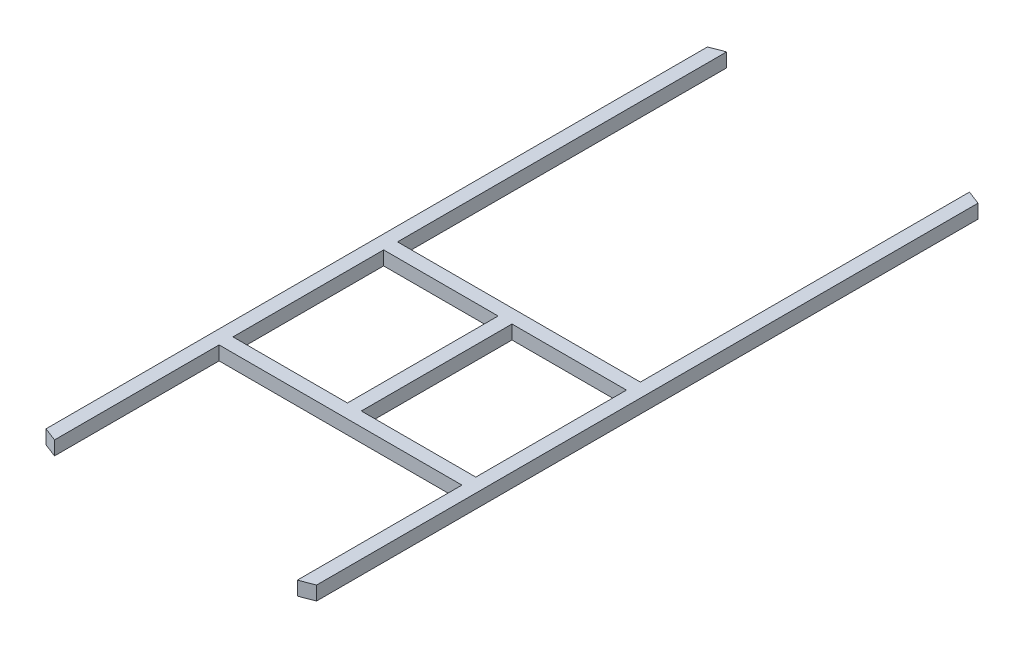
ISO-10303-21;
HEADER;
FILE_DESCRIPTION(('STEP AP214'),'2;1');
FILE_NAME('part.step','',(''),(''),'','','');
FILE_SCHEMA(('AUTOMOTIVE_DESIGN { 1 0 10303 214 1 1 1 1 }'));
ENDSEC;
DATA;
#1=APPLICATION_CONTEXT('core data for automotive mechanical design processes');
#2=APPLICATION_PROTOCOL_DEFINITION('international standard','automotive_design',2000,#1);
#3=PRODUCT_CONTEXT('',#1,'mechanical');
#4=PRODUCT('Part','Part','',(#3));
#5=PRODUCT_RELATED_PRODUCT_CATEGORY('part','',(#4));
#6=PRODUCT_DEFINITION_FORMATION('','',#4);
#7=PRODUCT_DEFINITION_CONTEXT('part definition',#1,'design');
#8=PRODUCT_DEFINITION('design','',#6,#7);
#9=PRODUCT_DEFINITION_SHAPE('','',#8);
#10=(LENGTH_UNIT() NAMED_UNIT(*) SI_UNIT(.MILLI.,.METRE.));
#11=(NAMED_UNIT(*) PLANE_ANGLE_UNIT() SI_UNIT($,.RADIAN.));
#12=(NAMED_UNIT(*) SI_UNIT($,.STERADIAN.) SOLID_ANGLE_UNIT());
#13=UNCERTAINTY_MEASURE_WITH_UNIT(LENGTH_MEASURE(1.E-05),#10,'distance_accuracy_value','');
#14=(GEOMETRIC_REPRESENTATION_CONTEXT(3) GLOBAL_UNCERTAINTY_ASSIGNED_CONTEXT((#13)) GLOBAL_UNIT_ASSIGNED_CONTEXT((#10,
#11,#12)) REPRESENTATION_CONTEXT('',''));
#15=CARTESIAN_POINT('',(0.,0.,0.));
#16=DIRECTION('',(0.,0.,1.));
#17=DIRECTION('',(1.,0.,0.));
#18=AXIS2_PLACEMENT_3D('',#15,#16,#17);
#19=CARTESIAN_POINT('',(0.,4.,0.));
#20=DIRECTION('',(0.,1.,0.));
#21=DIRECTION('',(0.,0.,1.));
#22=AXIS2_PLACEMENT_3D('',#19,#20,#21);
#23=PLANE('',#22);
#24=DIRECTION('',(0.,0.,1.));
#25=VECTOR('',#24,1.);
#26=CARTESIAN_POINT('',(0.,4.,95.33));
#27=LINE('',#26,#25);
#28=CARTESIAN_POINT('',(0.,4.,-95.33));
#29=VERTEX_POINT('',#28);
#30=CARTESIAN_POINT('',(0.,4.,95.33));
#31=VERTEX_POINT('',#30);
#32=EDGE_CURVE('E274',#29,#31,#27,.T.);
#33=ORIENTED_EDGE('',*,*,#32,.T.);
#34=DIRECTION('',(0.933225292836744,0.,0.35929173774215));
#35=VECTOR('',#34,1.);
#36=CARTESIAN_POINT('',(4.,4.,96.87));
#37=LINE('',#36,#35);
#38=CARTESIAN_POINT('',(4.,4.,96.87));
#39=VERTEX_POINT('',#38);
#40=EDGE_CURVE('E278',#31,#39,#37,.T.);
#41=ORIENTED_EDGE('',*,*,#40,.T.);
#42=DIRECTION('',(0.,0.,-1.));
#43=VECTOR('',#42,1.);
#44=CARTESIAN_POINT('',(4.,4.,49.435));
#45=LINE('',#44,#43);
#46=CARTESIAN_POINT('',(4.,4.,49.435));
#47=VERTEX_POINT('',#46);
#48=EDGE_CURVE('E282',#39,#47,#45,.T.);
#49=ORIENTED_EDGE('',*,*,#48,.T.);
#50=DIRECTION('',(1.,0.,0.));
#51=VECTOR('',#50,1.);
#52=CARTESIAN_POINT('',(4.,4.,49.435));
#53=LINE('',#52,#51);
#54=CARTESIAN_POINT('',(74.,4.,49.435));
#55=VERTEX_POINT('',#54);
#56=EDGE_CURVE('E285',#47,#55,#53,.T.);
#57=ORIENTED_EDGE('',*,*,#56,.T.);
#58=DIRECTION('',(0.,0.,1.));
#59=VECTOR('',#58,1.);
#60=CARTESIAN_POINT('',(74.,4.,49.435));
#61=LINE('',#60,#59);
#62=CARTESIAN_POINT('',(74.,4.,96.87));
#63=VERTEX_POINT('',#62);
#64=EDGE_CURVE('E288',#55,#63,#61,.T.);
#65=ORIENTED_EDGE('',*,*,#64,.T.);
#66=DIRECTION('',(0.933225292836744,0.,-0.359291737742149));
#67=VECTOR('',#66,1.);
#68=CARTESIAN_POINT('',(74.,4.,96.87));
#69=LINE('',#68,#67);
#70=CARTESIAN_POINT('',(78.,4.,95.33));
#71=VERTEX_POINT('',#70);
#72=EDGE_CURVE('E291',#63,#71,#69,.T.);
#73=ORIENTED_EDGE('',*,*,#72,.T.);
#74=DIRECTION('',(0.,0.,-1.));
#75=VECTOR('',#74,1.);
#76=CARTESIAN_POINT('',(78.,4.,95.33));
#77=LINE('',#76,#75);
#78=CARTESIAN_POINT('',(78.,4.,-95.33));
#79=VERTEX_POINT('',#78);
#80=EDGE_CURVE('E294',#71,#79,#77,.T.);
#81=ORIENTED_EDGE('',*,*,#80,.T.);
#82=DIRECTION('',(-0.933225292836747,0.,-0.359291737742142));
#83=VECTOR('',#82,1.);
#84=CARTESIAN_POINT('',(78.,4.,-95.33));
#85=LINE('',#84,#83);
#86=CARTESIAN_POINT('',(74.,4.,-96.87));
#87=VERTEX_POINT('',#86);
#88=EDGE_CURVE('E297',#79,#87,#85,.T.);
#89=ORIENTED_EDGE('',*,*,#88,.T.);
#90=DIRECTION('',(0.,0.,1.));
#91=VECTOR('',#90,1.);
#92=CARTESIAN_POINT('',(74.,4.,-96.87));
#93=LINE('',#92,#91);
#94=CARTESIAN_POINT('',(74.,4.,-1.99999999999999));
#95=VERTEX_POINT('',#94);
#96=EDGE_CURVE('E300',#87,#95,#93,.T.);
#97=ORIENTED_EDGE('',*,*,#96,.T.);
#98=DIRECTION('',(-1.,0.,0.));
#99=VECTOR('',#98,1.);
#100=CARTESIAN_POINT('',(74.,4.,-1.99999999999999));
#101=LINE('',#100,#99);
#102=CARTESIAN_POINT('',(4.,4.,-1.99999999999999));
#103=VERTEX_POINT('',#102);
#104=EDGE_CURVE('E303',#95,#103,#101,.T.);
#105=ORIENTED_EDGE('',*,*,#104,.T.);
#106=DIRECTION('',(0.,0.,-1.));
#107=VECTOR('',#106,1.);
#108=CARTESIAN_POINT('',(4.,4.,-1.99999999999999));
#109=LINE('',#108,#107);
#110=CARTESIAN_POINT('',(4.,4.,-96.87));
#111=VERTEX_POINT('',#110);
#112=EDGE_CURVE('E306',#103,#111,#109,.T.);
#113=ORIENTED_EDGE('',*,*,#112,.T.);
#114=DIRECTION('',(-0.933225292836746,0.,0.359291737742144));
#115=VECTOR('',#114,1.);
#116=CARTESIAN_POINT('',(0.,4.,-95.33));
#117=LINE('',#116,#115);
#118=EDGE_CURVE('E309',#111,#29,#117,.T.);
#119=ORIENTED_EDGE('',*,*,#118,.T.);
#120=EDGE_LOOP('',(#33,#41,#49,#57,#65,#73,#81,#89,#97,#105,#113,#119));
#121=FACE_BOUND('',#120,.T.);
#122=DIRECTION('',(1.,0.,0.));
#123=VECTOR('',#122,1.);
#124=CARTESIAN_POINT('',(37.,4.,45.435));
#125=LINE('',#124,#123);
#126=CARTESIAN_POINT('',(4.,4.,45.435));
#127=VERTEX_POINT('',#126);
#128=CARTESIAN_POINT('',(37.,4.,45.435));
#129=VERTEX_POINT('',#128);
#130=EDGE_CURVE('E234',#127,#129,#125,.T.);
#131=ORIENTED_EDGE('',*,*,#130,.F.);
#132=DIRECTION('',(0.,0.,1.));
#133=VECTOR('',#132,1.);
#134=CARTESIAN_POINT('',(4.,4.,2.00000000000001));
#135=LINE('',#134,#133);
#136=CARTESIAN_POINT('',(4.,4.,2.00000000000001));
#137=VERTEX_POINT('',#136);
#138=EDGE_CURVE('E231',#137,#127,#135,.T.);
#139=ORIENTED_EDGE('',*,*,#138,.F.);
#140=DIRECTION('',(-1.,0.,0.));
#141=VECTOR('',#140,1.);
#142=CARTESIAN_POINT('',(4.,4.,2.00000000000001));
#143=LINE('',#142,#141);
#144=CARTESIAN_POINT('',(37.,4.,1.99999999999999));
#145=VERTEX_POINT('',#144);
#146=EDGE_CURVE('E242',#145,#137,#143,.T.);
#147=ORIENTED_EDGE('',*,*,#146,.F.);
#148=DIRECTION('',(0.,0.,-1.));
#149=VECTOR('',#148,1.);
#150=CARTESIAN_POINT('',(37.,4.,1.99999999999999));
#151=LINE('',#150,#149);
#152=EDGE_CURVE('E238',#129,#145,#151,.T.);
#153=ORIENTED_EDGE('',*,*,#152,.F.);
#154=EDGE_LOOP('',(#131,#139,#147,#153));
#155=FACE_BOUND('',#154,.T.);
#156=DIRECTION('',(0.,0.,1.));
#157=VECTOR('',#156,1.);
#158=CARTESIAN_POINT('',(41.,4.,1.99999999999999));
#159=LINE('',#158,#157);
#160=CARTESIAN_POINT('',(41.,4.,1.99999999999999));
#161=VERTEX_POINT('',#160);
#162=CARTESIAN_POINT('',(41.,4.,45.435));
#163=VERTEX_POINT('',#162);
#164=EDGE_CURVE('E192',#161,#163,#159,.T.);
#165=ORIENTED_EDGE('',*,*,#164,.F.);
#166=DIRECTION('',(-1.,0.,0.));
#167=VECTOR('',#166,1.);
#168=CARTESIAN_POINT('',(41.,4.,1.99999999999999));
#169=LINE('',#168,#167);
#170=CARTESIAN_POINT('',(74.,4.,2.00000000000001));
#171=VERTEX_POINT('',#170);
#172=EDGE_CURVE('E183',#171,#161,#169,.T.);
#173=ORIENTED_EDGE('',*,*,#172,.F.);
#174=DIRECTION('',(0.,0.,-1.));
#175=VECTOR('',#174,1.);
#176=CARTESIAN_POINT('',(74.,4.,2.00000000000001));
#177=LINE('',#176,#175);
#178=CARTESIAN_POINT('',(74.,4.,45.435));
#179=VERTEX_POINT('',#178);
#180=EDGE_CURVE('E209',#179,#171,#177,.T.);
#181=ORIENTED_EDGE('',*,*,#180,.F.);
#182=DIRECTION('',(1.,0.,0.));
#183=VECTOR('',#182,1.);
#184=CARTESIAN_POINT('',(74.,4.,45.435));
#185=LINE('',#184,#183);
#186=EDGE_CURVE('E205',#163,#179,#185,.T.);
#187=ORIENTED_EDGE('',*,*,#186,.F.);
#188=EDGE_LOOP('',(#165,#173,#181,#187));
#189=FACE_BOUND('',#188,.T.);
#190=ADVANCED_FACE('F45',(#121,#155,#189),#23,.T.);
#191=CARTESIAN_POINT('',(0.,0.,0.));
#192=DIRECTION('',(0.,1.,0.));
#193=DIRECTION('',(0.,0.,1.));
#194=AXIS2_PLACEMENT_3D('',#191,#192,#193);
#195=PLANE('',#194);
#196=DIRECTION('',(0.,0.,1.));
#197=VECTOR('',#196,1.);
#198=CARTESIAN_POINT('',(4.,0.,2.00000000000001));
#199=LINE('',#198,#197);
#200=CARTESIAN_POINT('',(4.,0.,2.00000000000001));
#201=VERTEX_POINT('',#200);
#202=CARTESIAN_POINT('',(4.,0.,45.435));
#203=VERTEX_POINT('',#202);
#204=EDGE_CURVE('E201',#201,#203,#199,.T.);
#205=ORIENTED_EDGE('',*,*,#204,.T.);
#206=DIRECTION('',(1.,0.,0.));
#207=VECTOR('',#206,1.);
#208=CARTESIAN_POINT('',(37.,0.,45.435));
#209=LINE('',#208,#207);
#210=CARTESIAN_POINT('',(37.,0.,45.435));
#211=VERTEX_POINT('',#210);
#212=EDGE_CURVE('E249',#203,#211,#209,.T.);
#213=ORIENTED_EDGE('',*,*,#212,.T.);
#214=DIRECTION('',(0.,0.,-1.));
#215=VECTOR('',#214,1.);
#216=CARTESIAN_POINT('',(37.,0.,1.99999999999999));
#217=LINE('',#216,#215);
#218=CARTESIAN_POINT('',(37.,0.,1.99999999999999));
#219=VERTEX_POINT('',#218);
#220=EDGE_CURVE('E253',#211,#219,#217,.T.);
#221=ORIENTED_EDGE('',*,*,#220,.T.);
#222=DIRECTION('',(-1.,0.,0.));
#223=VECTOR('',#222,1.);
#224=CARTESIAN_POINT('',(4.,0.,2.00000000000001));
#225=LINE('',#224,#223);
#226=EDGE_CURVE('E235',#219,#201,#225,.T.);
#227=ORIENTED_EDGE('',*,*,#226,.T.);
#228=EDGE_LOOP('',(#205,#213,#221,#227));
#229=FACE_BOUND('',#228,.T.);
#230=DIRECTION('',(0.933225292836744,0.,0.35929173774215));
#231=VECTOR('',#230,1.);
#232=CARTESIAN_POINT('',(4.,0.,96.87));
#233=LINE('',#232,#231);
#234=CARTESIAN_POINT('',(0.,0.,95.33));
#235=VERTEX_POINT('',#234);
#236=CARTESIAN_POINT('',(4.,0.,96.87));
#237=VERTEX_POINT('',#236);
#238=EDGE_CURVE('E273',#235,#237,#233,.T.);
#239=ORIENTED_EDGE('',*,*,#238,.F.);
#240=DIRECTION('',(0.,0.,1.));
#241=VECTOR('',#240,1.);
#242=CARTESIAN_POINT('',(0.,0.,0.));
#243=LINE('',#242,#241);
#244=CARTESIAN_POINT('',(0.,0.,-95.33));
#245=VERTEX_POINT('',#244);
#246=EDGE_CURVE('E279',#245,#235,#243,.T.);
#247=ORIENTED_EDGE('',*,*,#246,.F.);
#248=DIRECTION('',(-0.933225292836746,0.,0.359291737742144));
#249=VECTOR('',#248,1.);
#250=CARTESIAN_POINT('',(0.,0.,-95.33));
#251=LINE('',#250,#249);
#252=CARTESIAN_POINT('',(4.,0.,-96.87));
#253=VERTEX_POINT('',#252);
#254=EDGE_CURVE('E343',#253,#245,#251,.T.);
#255=ORIENTED_EDGE('',*,*,#254,.F.);
#256=DIRECTION('',(0.,0.,-1.));
#257=VECTOR('',#256,1.);
#258=CARTESIAN_POINT('',(4.,0.,-1.99999999999999));
#259=LINE('',#258,#257);
#260=CARTESIAN_POINT('',(4.,0.,-1.99999999999999));
#261=VERTEX_POINT('',#260);
#262=EDGE_CURVE('E340',#261,#253,#259,.T.);
#263=ORIENTED_EDGE('',*,*,#262,.F.);
#264=DIRECTION('',(-1.,0.,0.));
#265=VECTOR('',#264,1.);
#266=CARTESIAN_POINT('',(74.,0.,-1.99999999999999));
#267=LINE('',#266,#265);
#268=CARTESIAN_POINT('',(74.,0.,-1.99999999999999));
#269=VERTEX_POINT('',#268);
#270=EDGE_CURVE('E337',#269,#261,#267,.T.);
#271=ORIENTED_EDGE('',*,*,#270,.F.);
#272=DIRECTION('',(0.,0.,1.));
#273=VECTOR('',#272,1.);
#274=CARTESIAN_POINT('',(74.,0.,-96.87));
#275=LINE('',#274,#273);
#276=CARTESIAN_POINT('',(74.,0.,-96.87));
#277=VERTEX_POINT('',#276);
#278=EDGE_CURVE('E334',#277,#269,#275,.T.);
#279=ORIENTED_EDGE('',*,*,#278,.F.);
#280=DIRECTION('',(-0.933225292836747,0.,-0.359291737742142));
#281=VECTOR('',#280,1.);
#282=CARTESIAN_POINT('',(78.,0.,-95.33));
#283=LINE('',#282,#281);
#284=CARTESIAN_POINT('',(78.,0.,-95.33));
#285=VERTEX_POINT('',#284);
#286=EDGE_CURVE('E331',#285,#277,#283,.T.);
#287=ORIENTED_EDGE('',*,*,#286,.F.);
#288=DIRECTION('',(0.,0.,-1.));
#289=VECTOR('',#288,1.);
#290=CARTESIAN_POINT('',(78.,0.,95.33));
#291=LINE('',#290,#289);
#292=CARTESIAN_POINT('',(78.,0.,95.33));
#293=VERTEX_POINT('',#292);
#294=EDGE_CURVE('E328',#293,#285,#291,.T.);
#295=ORIENTED_EDGE('',*,*,#294,.F.);
#296=DIRECTION('',(0.933225292836744,0.,-0.359291737742149));
#297=VECTOR('',#296,1.);
#298=CARTESIAN_POINT('',(74.,0.,96.87));
#299=LINE('',#298,#297);
#300=CARTESIAN_POINT('',(74.,0.,96.87));
#301=VERTEX_POINT('',#300);
#302=EDGE_CURVE('E325',#301,#293,#299,.T.);
#303=ORIENTED_EDGE('',*,*,#302,.F.);
#304=DIRECTION('',(0.,0.,1.));
#305=VECTOR('',#304,1.);
#306=CARTESIAN_POINT('',(74.,0.,49.435));
#307=LINE('',#306,#305);
#308=CARTESIAN_POINT('',(74.,0.,49.435));
#309=VERTEX_POINT('',#308);
#310=EDGE_CURVE('E322',#309,#301,#307,.T.);
#311=ORIENTED_EDGE('',*,*,#310,.F.);
#312=DIRECTION('',(1.,0.,0.));
#313=VECTOR('',#312,1.);
#314=CARTESIAN_POINT('',(4.,0.,49.435));
#315=LINE('',#314,#313);
#316=CARTESIAN_POINT('',(4.,0.,49.435));
#317=VERTEX_POINT('',#316);
#318=EDGE_CURVE('E319',#317,#309,#315,.T.);
#319=ORIENTED_EDGE('',*,*,#318,.F.);
#320=DIRECTION('',(0.,0.,-1.));
#321=VECTOR('',#320,1.);
#322=CARTESIAN_POINT('',(4.,0.,49.435));
#323=LINE('',#322,#321);
#324=EDGE_CURVE('E316',#237,#317,#323,.T.);
#325=ORIENTED_EDGE('',*,*,#324,.F.);
#326=EDGE_LOOP('',(#239,#247,#255,#263,#271,#279,#287,#295,#303,#311,#319,#325));
#327=FACE_BOUND('',#326,.T.);
#328=DIRECTION('',(-1.,0.,0.));
#329=VECTOR('',#328,1.);
#330=CARTESIAN_POINT('',(41.,0.,1.99999999999999));
#331=LINE('',#330,#329);
#332=CARTESIAN_POINT('',(74.,0.,2.00000000000001));
#333=VERTEX_POINT('',#332);
#334=CARTESIAN_POINT('',(41.,0.,1.99999999999999));
#335=VERTEX_POINT('',#334);
#336=EDGE_CURVE('E69',#333,#335,#331,.T.);
#337=ORIENTED_EDGE('',*,*,#336,.T.);
#338=DIRECTION('',(0.,0.,1.));
#339=VECTOR('',#338,1.);
#340=CARTESIAN_POINT('',(41.,0.,1.99999999999999));
#341=LINE('',#340,#339);
#342=CARTESIAN_POINT('',(41.,0.,45.435));
#343=VERTEX_POINT('',#342);
#344=EDGE_CURVE('E199',#335,#343,#341,.T.);
#345=ORIENTED_EDGE('',*,*,#344,.T.);
#346=DIRECTION('',(1.,0.,0.));
#347=VECTOR('',#346,1.);
#348=CARTESIAN_POINT('',(74.,0.,45.435));
#349=LINE('',#348,#347);
#350=CARTESIAN_POINT('',(74.,0.,45.435));
#351=VERTEX_POINT('',#350);
#352=EDGE_CURVE('E218',#343,#351,#349,.T.);
#353=ORIENTED_EDGE('',*,*,#352,.T.);
#354=DIRECTION('',(0.,0.,-1.));
#355=VECTOR('',#354,1.);
#356=CARTESIAN_POINT('',(74.,0.,2.00000000000001));
#357=LINE('',#356,#355);
#358=EDGE_CURVE('E193',#351,#333,#357,.T.);
#359=ORIENTED_EDGE('',*,*,#358,.T.);
#360=EDGE_LOOP('',(#337,#345,#353,#359));
#361=FACE_BOUND('',#360,.T.);
#362=ADVANCED_FACE('F398',(#229,#327,#361),#195,.F.);
#363=CARTESIAN_POINT('',(4.,4.,96.87));
#364=DIRECTION('',(0.35929173774215,0.,-0.933225292836744));
#365=DIRECTION('',(-0.933225292836744,0.,-0.35929173774215));
#366=AXIS2_PLACEMENT_3D('',#363,#364,#365);
#367=PLANE('',#366);
#368=ORIENTED_EDGE('',*,*,#238,.T.);
#369=DIRECTION('',(0.,-1.,0.));
#370=VECTOR('',#369,1.);
#371=CARTESIAN_POINT('',(4.,4.,96.87));
#372=LINE('',#371,#370);
#373=EDGE_CURVE('E54',#39,#237,#372,.T.);
#374=ORIENTED_EDGE('',*,*,#373,.F.);
#375=ORIENTED_EDGE('',*,*,#40,.F.);
#376=DIRECTION('',(0.,-1.,0.));
#377=VECTOR('',#376,1.);
#378=CARTESIAN_POINT('',(0.,4.,95.33));
#379=LINE('',#378,#377);
#380=EDGE_CURVE('E11',#31,#235,#379,.T.);
#381=ORIENTED_EDGE('',*,*,#380,.T.);
#382=EDGE_LOOP('',(#368,#374,#375,#381));
#383=FACE_BOUND('',#382,.T.);
#384=ADVANCED_FACE('F47',(#383),#367,.F.);
#385=CARTESIAN_POINT('',(4.,4.,49.435));
#386=DIRECTION('',(-1.,0.,0.));
#387=DIRECTION('',(0.,0.,1.));
#388=AXIS2_PLACEMENT_3D('',#385,#386,#387);
#389=PLANE('',#388);
#390=ORIENTED_EDGE('',*,*,#324,.T.);
#391=DIRECTION('',(0.,-1.,0.));
#392=VECTOR('',#391,1.);
#393=CARTESIAN_POINT('',(4.,4.,49.435));
#394=LINE('',#393,#392);
#395=EDGE_CURVE('E383',#47,#317,#394,.T.);
#396=ORIENTED_EDGE('',*,*,#395,.F.);
#397=ORIENTED_EDGE('',*,*,#48,.F.);
#398=ORIENTED_EDGE('',*,*,#373,.T.);
#399=EDGE_LOOP('',(#390,#396,#397,#398));
#400=FACE_BOUND('',#399,.T.);
#401=ADVANCED_FACE('F392',(#400),#389,.F.);
#402=CARTESIAN_POINT('',(4.,4.,49.435));
#403=DIRECTION('',(0.,0.,-1.));
#404=DIRECTION('',(-1.,0.,0.));
#405=AXIS2_PLACEMENT_3D('',#402,#403,#404);
#406=PLANE('',#405);
#407=ORIENTED_EDGE('',*,*,#318,.T.);
#408=DIRECTION('',(0.,-1.,0.));
#409=VECTOR('',#408,1.);
#410=CARTESIAN_POINT('',(74.,4.,49.435));
#411=LINE('',#410,#409);
#412=EDGE_CURVE('E379',#55,#309,#411,.T.);
#413=ORIENTED_EDGE('',*,*,#412,.F.);
#414=ORIENTED_EDGE('',*,*,#56,.F.);
#415=ORIENTED_EDGE('',*,*,#395,.T.);
#416=EDGE_LOOP('',(#407,#413,#414,#415));
#417=FACE_BOUND('',#416,.T.);
#418=ADVANCED_FACE('F405',(#417),#406,.F.);
#419=CARTESIAN_POINT('',(74.,4.,49.435));
#420=DIRECTION('',(1.,0.,0.));
#421=DIRECTION('',(0.,0.,-1.));
#422=AXIS2_PLACEMENT_3D('',#419,#420,#421);
#423=PLANE('',#422);
#424=ORIENTED_EDGE('',*,*,#310,.T.);
#425=DIRECTION('',(0.,-1.,0.));
#426=VECTOR('',#425,1.);
#427=CARTESIAN_POINT('',(74.,4.,96.87));
#428=LINE('',#427,#426);
#429=EDGE_CURVE('E375',#63,#301,#428,.T.);
#430=ORIENTED_EDGE('',*,*,#429,.F.);
#431=ORIENTED_EDGE('',*,*,#64,.F.);
#432=ORIENTED_EDGE('',*,*,#412,.T.);
#433=EDGE_LOOP('',(#424,#430,#431,#432));
#434=FACE_BOUND('',#433,.T.);
#435=ADVANCED_FACE('F409',(#434),#423,.F.);
#436=CARTESIAN_POINT('',(74.,4.,96.87));
#437=DIRECTION('',(-0.359291737742149,0.,-0.933225292836744));
#438=DIRECTION('',(-0.933225292836744,0.,0.359291737742149));
#439=AXIS2_PLACEMENT_3D('',#436,#437,#438);
#440=PLANE('',#439);
#441=ORIENTED_EDGE('',*,*,#302,.T.);
#442=DIRECTION('',(0.,-1.,0.));
#443=VECTOR('',#442,1.);
#444=CARTESIAN_POINT('',(78.,4.,95.33));
#445=LINE('',#444,#443);
#446=EDGE_CURVE('E371',#71,#293,#445,.T.);
#447=ORIENTED_EDGE('',*,*,#446,.F.);
#448=ORIENTED_EDGE('',*,*,#72,.F.);
#449=ORIENTED_EDGE('',*,*,#429,.T.);
#450=EDGE_LOOP('',(#441,#447,#448,#449));
#451=FACE_BOUND('',#450,.T.);
#452=ADVANCED_FACE('F449',(#451),#440,.F.);
#453=CARTESIAN_POINT('',(78.,4.,95.33));
#454=DIRECTION('',(-1.,0.,0.));
#455=DIRECTION('',(0.,0.,1.));
#456=AXIS2_PLACEMENT_3D('',#453,#454,#455);
#457=PLANE('',#456);
#458=ORIENTED_EDGE('',*,*,#294,.T.);
#459=DIRECTION('',(0.,-1.,0.));
#460=VECTOR('',#459,1.);
#461=CARTESIAN_POINT('',(78.,4.,-95.33));
#462=LINE('',#461,#460);
#463=EDGE_CURVE('E367',#79,#285,#462,.T.);
#464=ORIENTED_EDGE('',*,*,#463,.F.);
#465=ORIENTED_EDGE('',*,*,#80,.F.);
#466=ORIENTED_EDGE('',*,*,#446,.T.);
#467=EDGE_LOOP('',(#458,#464,#465,#466));
#468=FACE_BOUND('',#467,.T.);
#469=ADVANCED_FACE('F447',(#468),#457,.F.);
#470=CARTESIAN_POINT('',(78.,4.,-95.33));
#471=DIRECTION('',(-0.359291737742142,0.,0.933225292836747));
#472=DIRECTION('',(0.933225292836747,0.,0.359291737742142));
#473=AXIS2_PLACEMENT_3D('',#470,#471,#472);
#474=PLANE('',#473);
#475=ORIENTED_EDGE('',*,*,#286,.T.);
#476=DIRECTION('',(0.,-1.,0.));
#477=VECTOR('',#476,1.);
#478=CARTESIAN_POINT('',(74.,4.,-96.87));
#479=LINE('',#478,#477);
#480=EDGE_CURVE('E363',#87,#277,#479,.T.);
#481=ORIENTED_EDGE('',*,*,#480,.F.);
#482=ORIENTED_EDGE('',*,*,#88,.F.);
#483=ORIENTED_EDGE('',*,*,#463,.T.);
#484=EDGE_LOOP('',(#475,#481,#482,#483));
#485=FACE_BOUND('',#484,.T.);
#486=ADVANCED_FACE('F443',(#485),#474,.F.);
#487=CARTESIAN_POINT('',(74.,4.,-96.87));
#488=DIRECTION('',(1.,0.,0.));
#489=DIRECTION('',(0.,0.,-1.));
#490=AXIS2_PLACEMENT_3D('',#487,#488,#489);
#491=PLANE('',#490);
#492=ORIENTED_EDGE('',*,*,#278,.T.);
#493=DIRECTION('',(0.,-1.,0.));
#494=VECTOR('',#493,1.);
#495=CARTESIAN_POINT('',(74.,4.,-1.99999999999999));
#496=LINE('',#495,#494);
#497=EDGE_CURVE('E359',#95,#269,#496,.T.);
#498=ORIENTED_EDGE('',*,*,#497,.F.);
#499=ORIENTED_EDGE('',*,*,#96,.F.);
#500=ORIENTED_EDGE('',*,*,#480,.T.);
#501=EDGE_LOOP('',(#492,#498,#499,#500));
#502=FACE_BOUND('',#501,.T.);
#503=ADVANCED_FACE('F438',(#502),#491,.F.);
#504=CARTESIAN_POINT('',(74.,4.,-1.99999999999999));
#505=DIRECTION('',(0.,0.,1.));
#506=DIRECTION('',(1.,0.,0.));
#507=AXIS2_PLACEMENT_3D('',#504,#505,#506);
#508=PLANE('',#507);
#509=ORIENTED_EDGE('',*,*,#270,.T.);
#510=DIRECTION('',(0.,-1.,0.));
#511=VECTOR('',#510,1.);
#512=CARTESIAN_POINT('',(4.,4.,-1.99999999999999));
#513=LINE('',#512,#511);
#514=EDGE_CURVE('E355',#103,#261,#513,.T.);
#515=ORIENTED_EDGE('',*,*,#514,.F.);
#516=ORIENTED_EDGE('',*,*,#104,.F.);
#517=ORIENTED_EDGE('',*,*,#497,.T.);
#518=EDGE_LOOP('',(#509,#515,#516,#517));
#519=FACE_BOUND('',#518,.T.);
#520=ADVANCED_FACE('F432',(#519),#508,.F.);
#521=CARTESIAN_POINT('',(4.,4.,-1.99999999999999));
#522=DIRECTION('',(-1.,0.,0.));
#523=DIRECTION('',(0.,0.,1.));
#524=AXIS2_PLACEMENT_3D('',#521,#522,#523);
#525=PLANE('',#524);
#526=ORIENTED_EDGE('',*,*,#262,.T.);
#527=DIRECTION('',(0.,-1.,0.));
#528=VECTOR('',#527,1.);
#529=CARTESIAN_POINT('',(4.,4.,-96.87));
#530=LINE('',#529,#528);
#531=EDGE_CURVE('E351',#111,#253,#530,.T.);
#532=ORIENTED_EDGE('',*,*,#531,.F.);
#533=ORIENTED_EDGE('',*,*,#112,.F.);
#534=ORIENTED_EDGE('',*,*,#514,.T.);
#535=EDGE_LOOP('',(#526,#532,#533,#534));
#536=FACE_BOUND('',#535,.T.);
#537=ADVANCED_FACE('F428',(#536),#525,.F.);
#538=CARTESIAN_POINT('',(0.,4.,-95.33));
#539=DIRECTION('',(0.359291737742144,0.,0.933225292836746));
#540=DIRECTION('',(0.933225292836746,0.,-0.359291737742144));
#541=AXIS2_PLACEMENT_3D('',#538,#539,#540);
#542=PLANE('',#541);
#543=ORIENTED_EDGE('',*,*,#254,.T.);
#544=DIRECTION('',(0.,-1.,0.));
#545=VECTOR('',#544,1.);
#546=CARTESIAN_POINT('',(0.,4.,-95.33));
#547=LINE('',#546,#545);
#548=EDGE_CURVE('E313',#29,#245,#547,.T.);
#549=ORIENTED_EDGE('',*,*,#548,.F.);
#550=ORIENTED_EDGE('',*,*,#118,.F.);
#551=ORIENTED_EDGE('',*,*,#531,.T.);
#552=EDGE_LOOP('',(#543,#549,#550,#551));
#553=FACE_BOUND('',#552,.T.);
#554=ADVANCED_FACE('F423',(#553),#542,.F.);
#555=CARTESIAN_POINT('',(0.,4.,0.));
#556=DIRECTION('',(1.,0.,0.));
#557=DIRECTION('',(0.,0.,-1.));
#558=AXIS2_PLACEMENT_3D('',#555,#556,#557);
#559=PLANE('',#558);
#560=ORIENTED_EDGE('',*,*,#246,.T.);
#561=ORIENTED_EDGE('',*,*,#380,.F.);
#562=ORIENTED_EDGE('',*,*,#32,.F.);
#563=ORIENTED_EDGE('',*,*,#548,.T.);
#564=EDGE_LOOP('',(#560,#561,#562,#563));
#565=FACE_BOUND('',#564,.T.);
#566=ADVANCED_FACE('F417',(#565),#559,.F.);
#567=CARTESIAN_POINT('',(4.,4.,2.00000000000001));
#568=DIRECTION('',(1.,0.,0.));
#569=DIRECTION('',(0.,0.,-1.));
#570=AXIS2_PLACEMENT_3D('',#567,#568,#569);
#571=PLANE('',#570);
#572=ORIENTED_EDGE('',*,*,#204,.F.);
#573=DIRECTION('',(0.,-1.,0.));
#574=VECTOR('',#573,1.);
#575=CARTESIAN_POINT('',(4.,4.,2.00000000000001));
#576=LINE('',#575,#574);
#577=EDGE_CURVE('E245',#137,#201,#576,.T.);
#578=ORIENTED_EDGE('',*,*,#577,.F.);
#579=ORIENTED_EDGE('',*,*,#138,.T.);
#580=DIRECTION('',(0.,-1.,0.));
#581=VECTOR('',#580,1.);
#582=CARTESIAN_POINT('',(4.,4.,45.435));
#583=LINE('',#582,#581);
#584=EDGE_CURVE('E269',#127,#203,#583,.T.);
#585=ORIENTED_EDGE('',*,*,#584,.T.);
#586=EDGE_LOOP('',(#572,#578,#579,#585));
#587=FACE_BOUND('',#586,.T.);
#588=ADVANCED_FACE('F466',(#587),#571,.T.);
#589=CARTESIAN_POINT('',(37.,4.,45.435));
#590=DIRECTION('',(0.,0.,-1.));
#591=DIRECTION('',(-1.,0.,0.));
#592=AXIS2_PLACEMENT_3D('',#589,#590,#591);
#593=PLANE('',#592);
#594=ORIENTED_EDGE('',*,*,#212,.F.);
#595=ORIENTED_EDGE('',*,*,#584,.F.);
#596=ORIENTED_EDGE('',*,*,#130,.T.);
#597=DIRECTION('',(0.,-1.,0.));
#598=VECTOR('',#597,1.);
#599=CARTESIAN_POINT('',(37.,4.,45.435));
#600=LINE('',#599,#598);
#601=EDGE_CURVE('E266',#129,#211,#600,.T.);
#602=ORIENTED_EDGE('',*,*,#601,.T.);
#603=EDGE_LOOP('',(#594,#595,#596,#602));
#604=FACE_BOUND('',#603,.T.);
#605=ADVANCED_FACE('F516',(#604),#593,.T.);
#606=CARTESIAN_POINT('',(37.,4.,1.99999999999999));
#607=DIRECTION('',(-1.,0.,0.));
#608=DIRECTION('',(0.,0.,1.));
#609=AXIS2_PLACEMENT_3D('',#606,#607,#608);
#610=PLANE('',#609);
#611=ORIENTED_EDGE('',*,*,#220,.F.);
#612=ORIENTED_EDGE('',*,*,#601,.F.);
#613=ORIENTED_EDGE('',*,*,#152,.T.);
#614=DIRECTION('',(0.,-1.,0.));
#615=VECTOR('',#614,1.);
#616=CARTESIAN_POINT('',(37.,4.,1.99999999999999));
#617=LINE('',#616,#615);
#618=EDGE_CURVE('E263',#145,#219,#617,.T.);
#619=ORIENTED_EDGE('',*,*,#618,.T.);
#620=EDGE_LOOP('',(#611,#612,#613,#619));
#621=FACE_BOUND('',#620,.T.);
#622=ADVANCED_FACE('F524',(#621),#610,.T.);
#623=CARTESIAN_POINT('',(4.,4.,2.00000000000001));
#624=DIRECTION('',(0.,0.,1.));
#625=DIRECTION('',(1.,0.,0.));
#626=AXIS2_PLACEMENT_3D('',#623,#624,#625);
#627=PLANE('',#626);
#628=ORIENTED_EDGE('',*,*,#226,.F.);
#629=ORIENTED_EDGE('',*,*,#618,.F.);
#630=ORIENTED_EDGE('',*,*,#146,.T.);
#631=ORIENTED_EDGE('',*,*,#577,.T.);
#632=EDGE_LOOP('',(#628,#629,#630,#631));
#633=FACE_BOUND('',#632,.T.);
#634=ADVANCED_FACE('F532',(#633),#627,.T.);
#635=CARTESIAN_POINT('',(41.,4.,1.99999999999999));
#636=DIRECTION('',(0.,0.,1.));
#637=DIRECTION('',(1.,0.,0.));
#638=AXIS2_PLACEMENT_3D('',#635,#636,#637);
#639=PLANE('',#638);
#640=ORIENTED_EDGE('',*,*,#336,.F.);
#641=DIRECTION('',(0.,-1.,0.));
#642=VECTOR('',#641,1.);
#643=CARTESIAN_POINT('',(74.,4.,2.00000000000001));
#644=LINE('',#643,#642);
#645=EDGE_CURVE('E187',#171,#333,#644,.T.);
#646=ORIENTED_EDGE('',*,*,#645,.F.);
#647=ORIENTED_EDGE('',*,*,#172,.T.);
#648=DIRECTION('',(0.,-1.,0.));
#649=VECTOR('',#648,1.);
#650=CARTESIAN_POINT('',(41.,4.,1.99999999999999));
#651=LINE('',#650,#649);
#652=EDGE_CURVE('E186',#161,#335,#651,.T.);
#653=ORIENTED_EDGE('',*,*,#652,.T.);
#654=EDGE_LOOP('',(#640,#646,#647,#653));
#655=FACE_BOUND('',#654,.T.);
#656=ADVANCED_FACE('F185',(#655),#639,.T.);
#657=CARTESIAN_POINT('',(41.,4.,1.99999999999999));
#658=DIRECTION('',(1.,0.,0.));
#659=DIRECTION('',(0.,0.,-1.));
#660=AXIS2_PLACEMENT_3D('',#657,#658,#659);
#661=PLANE('',#660);
#662=ORIENTED_EDGE('',*,*,#344,.F.);
#663=ORIENTED_EDGE('',*,*,#652,.F.);
#664=ORIENTED_EDGE('',*,*,#164,.T.);
#665=DIRECTION('',(0.,-1.,0.));
#666=VECTOR('',#665,1.);
#667=CARTESIAN_POINT('',(41.,4.,45.435));
#668=LINE('',#667,#666);
#669=EDGE_CURVE('E202',#163,#343,#668,.T.);
#670=ORIENTED_EDGE('',*,*,#669,.T.);
#671=EDGE_LOOP('',(#662,#663,#664,#670));
#672=FACE_BOUND('',#671,.T.);
#673=ADVANCED_FACE('F196',(#672),#661,.T.);
#674=CARTESIAN_POINT('',(74.,4.,45.435));
#675=DIRECTION('',(0.,0.,-1.));
#676=DIRECTION('',(-1.,0.,0.));
#677=AXIS2_PLACEMENT_3D('',#674,#675,#676);
#678=PLANE('',#677);
#679=ORIENTED_EDGE('',*,*,#352,.F.);
#680=ORIENTED_EDGE('',*,*,#669,.F.);
#681=ORIENTED_EDGE('',*,*,#186,.T.);
#682=DIRECTION('',(0.,-1.,0.));
#683=VECTOR('',#682,1.);
#684=CARTESIAN_POINT('',(74.,4.,45.435));
#685=LINE('',#684,#683);
#686=EDGE_CURVE('E61',#179,#351,#685,.T.);
#687=ORIENTED_EDGE('',*,*,#686,.T.);
#688=EDGE_LOOP('',(#679,#680,#681,#687));
#689=FACE_BOUND('',#688,.T.);
#690=ADVANCED_FACE('F556',(#689),#678,.T.);
#691=CARTESIAN_POINT('',(74.,4.,2.00000000000001));
#692=DIRECTION('',(-1.,0.,0.));
#693=DIRECTION('',(0.,0.,1.));
#694=AXIS2_PLACEMENT_3D('',#691,#692,#693);
#695=PLANE('',#694);
#696=ORIENTED_EDGE('',*,*,#358,.F.);
#697=ORIENTED_EDGE('',*,*,#686,.F.);
#698=ORIENTED_EDGE('',*,*,#180,.T.);
#699=ORIENTED_EDGE('',*,*,#645,.T.);
#700=EDGE_LOOP('',(#696,#697,#698,#699));
#701=FACE_BOUND('',#700,.T.);
#702=ADVANCED_FACE('F564',(#701),#695,.T.);
#703=CLOSED_SHELL('',(#190,#362,#384,#401,#418,#435,#452,#469,#486,#503,#520,#537,#554,#566,
#588,#605,#622,#634,#656,#673,#690,#702));
#704=MANIFOLD_SOLID_BREP('B2',#703);
#705=ADVANCED_BREP_SHAPE_REPRESENTATION('',(#18,#704),#14);
#706=SHAPE_DEFINITION_REPRESENTATION(#9,#705);
ENDSEC;
END-ISO-10303-21;
